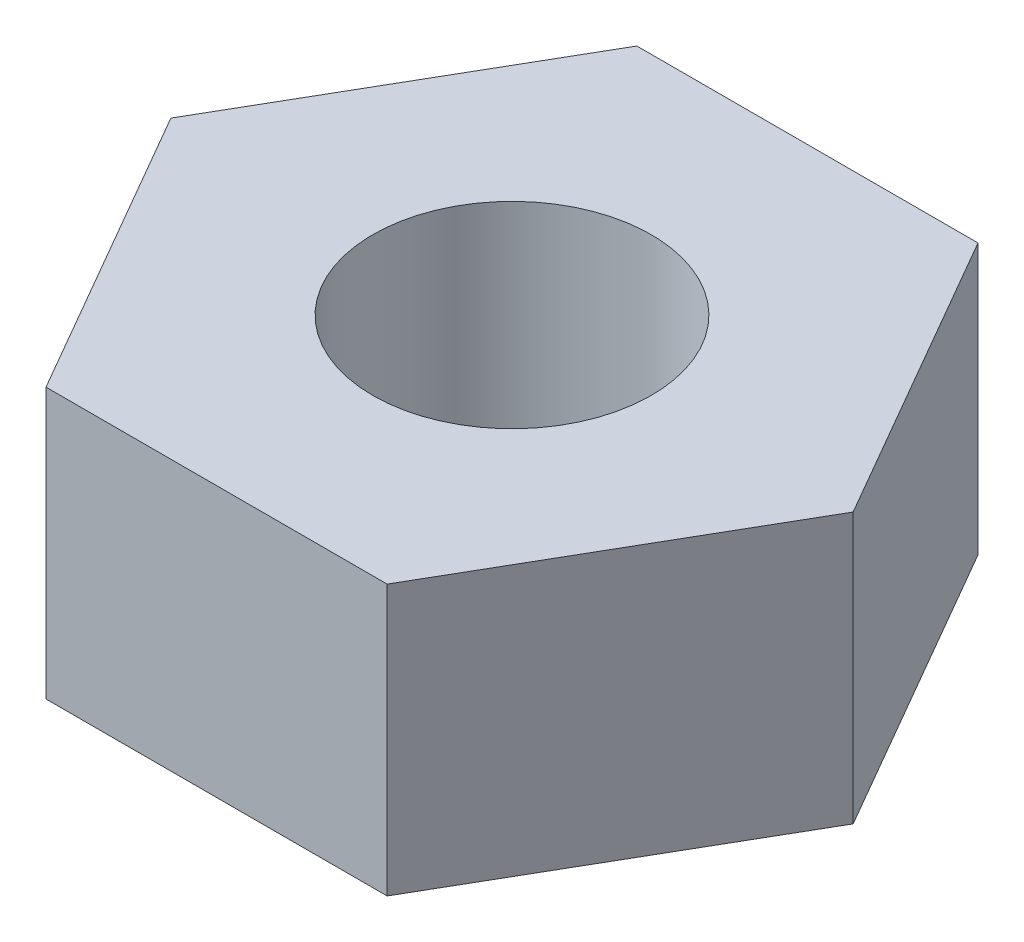
ISO-10303-21;
HEADER;
FILE_DESCRIPTION(('STEP AP214'),'2;1');
FILE_NAME('part.step','',(''),(''),'','','');
FILE_SCHEMA(('AUTOMOTIVE_DESIGN { 1 0 10303 214 1 1 1 1 }'));
ENDSEC;
DATA;
#1=APPLICATION_CONTEXT('core data for automotive mechanical design processes');
#2=APPLICATION_PROTOCOL_DEFINITION('international standard','automotive_design',2000,#1);
#3=PRODUCT_CONTEXT('',#1,'mechanical');
#4=PRODUCT('Part','Part','',(#3));
#5=PRODUCT_RELATED_PRODUCT_CATEGORY('part','',(#4));
#6=PRODUCT_DEFINITION_FORMATION('','',#4);
#7=PRODUCT_DEFINITION_CONTEXT('part definition',#1,'design');
#8=PRODUCT_DEFINITION('design','',#6,#7);
#9=PRODUCT_DEFINITION_SHAPE('','',#8);
#10=(LENGTH_UNIT() NAMED_UNIT(*) SI_UNIT(.MILLI.,.METRE.));
#11=(NAMED_UNIT(*) PLANE_ANGLE_UNIT() SI_UNIT($,.RADIAN.));
#12=(NAMED_UNIT(*) SI_UNIT($,.STERADIAN.) SOLID_ANGLE_UNIT());
#13=UNCERTAINTY_MEASURE_WITH_UNIT(LENGTH_MEASURE(1.E-05),#10,'distance_accuracy_value','');
#14=(GEOMETRIC_REPRESENTATION_CONTEXT(3) GLOBAL_UNCERTAINTY_ASSIGNED_CONTEXT((#13)) GLOBAL_UNIT_ASSIGNED_CONTEXT((#10,
#11,#12)) REPRESENTATION_CONTEXT('',''));
#15=CARTESIAN_POINT('',(0.,0.,0.));
#16=DIRECTION('',(0.,0.,1.));
#17=DIRECTION('',(1.,0.,0.));
#18=AXIS2_PLACEMENT_3D('',#15,#16,#17);
#19=CARTESIAN_POINT('',(-2.02072594216369,3.2,-3.5));
#20=DIRECTION('',(0.,1.,0.));
#21=DIRECTION('',(0.,0.,1.));
#22=AXIS2_PLACEMENT_3D('',#19,#20,#21);
#23=PLANE('',#22);
#24=DIRECTION('',(-1.,0.,0.));
#25=VECTOR('',#24,1.);
#26=CARTESIAN_POINT('',(2.02072594216369,3.2,-3.5));
#27=LINE('',#26,#25);
#28=CARTESIAN_POINT('',(2.02072594216369,3.2,-3.5));
#29=VERTEX_POINT('',#28);
#30=CARTESIAN_POINT('',(-2.02072594216369,3.2,-3.5));
#31=VERTEX_POINT('',#30);
#32=EDGE_CURVE('E130',#29,#31,#27,.T.);
#33=ORIENTED_EDGE('',*,*,#32,.T.);
#34=DIRECTION('',(-0.5,0.,0.866025403784439));
#35=VECTOR('',#34,1.);
#36=CARTESIAN_POINT('',(-2.02072594216369,3.2,-3.5));
#37=LINE('',#36,#35);
#38=CARTESIAN_POINT('',(-4.04145188432738,3.2,0.));
#39=VERTEX_POINT('',#38);
#40=EDGE_CURVE('E88',#31,#39,#37,.T.);
#41=ORIENTED_EDGE('',*,*,#40,.T.);
#42=DIRECTION('',(0.5,0.,0.866025403784439));
#43=VECTOR('',#42,1.);
#44=CARTESIAN_POINT('',(-4.04145188432738,3.2,0.));
#45=LINE('',#44,#43);
#46=CARTESIAN_POINT('',(-2.02072594216369,3.2,3.5));
#47=VERTEX_POINT('',#46);
#48=EDGE_CURVE('E101',#39,#47,#45,.T.);
#49=ORIENTED_EDGE('',*,*,#48,.T.);
#50=DIRECTION('',(1.,0.,0.));
#51=VECTOR('',#50,1.);
#52=CARTESIAN_POINT('',(-2.02072594216369,3.2,3.5));
#53=LINE('',#52,#51);
#54=CARTESIAN_POINT('',(2.02072594216369,3.2,3.5));
#55=VERTEX_POINT('',#54);
#56=EDGE_CURVE('E95',#47,#55,#53,.T.);
#57=ORIENTED_EDGE('',*,*,#56,.T.);
#58=DIRECTION('',(0.5,0.,-0.866025403784439));
#59=VECTOR('',#58,1.);
#60=CARTESIAN_POINT('',(2.02072594216369,3.2,3.5));
#61=LINE('',#60,#59);
#62=CARTESIAN_POINT('',(4.04145188432738,3.2,0.));
#63=VERTEX_POINT('',#62);
#64=EDGE_CURVE('E99',#55,#63,#61,.T.);
#65=ORIENTED_EDGE('',*,*,#64,.T.);
#66=DIRECTION('',(-0.5,0.,-0.866025403784439));
#67=VECTOR('',#66,1.);
#68=CARTESIAN_POINT('',(4.04145188432738,3.2,0.));
#69=LINE('',#68,#67);
#70=EDGE_CURVE('E51',#63,#29,#69,.T.);
#71=ORIENTED_EDGE('',*,*,#70,.T.);
#72=EDGE_LOOP('',(#33,#41,#49,#57,#65,#71));
#73=FACE_BOUND('',#72,.T.);
#74=CARTESIAN_POINT('',(0.,3.2,0.));
#75=DIRECTION('',(0.,1.,0.));
#76=DIRECTION('',(0.,0.,1.));
#77=AXIS2_PLACEMENT_3D('',#74,#75,#76);
#78=CIRCLE('',#77,1.65);
#79=CARTESIAN_POINT('',(0.,3.2,1.65));
#80=VERTEX_POINT('',#79);
#81=EDGE_CURVE('E123',#80,#80,#78,.T.);
#82=ORIENTED_EDGE('',*,*,#81,.F.);
#83=EDGE_LOOP('',(#82));
#84=FACE_BOUND('',#83,.T.);
#85=ADVANCED_FACE('F34',(#73,#84),#23,.T.);
#86=CARTESIAN_POINT('',(-2.02072594216369,0.,-3.5));
#87=DIRECTION('',(0.,1.,0.));
#88=DIRECTION('',(0.,0.,1.));
#89=AXIS2_PLACEMENT_3D('',#86,#87,#88);
#90=PLANE('',#89);
#91=DIRECTION('',(-1.,0.,0.));
#92=VECTOR('',#91,1.);
#93=CARTESIAN_POINT('',(2.02072594216369,0.,-3.5));
#94=LINE('',#93,#92);
#95=CARTESIAN_POINT('',(2.02072594216369,0.,-3.5));
#96=VERTEX_POINT('',#95);
#97=CARTESIAN_POINT('',(-2.02072594216369,0.,-3.5));
#98=VERTEX_POINT('',#97);
#99=EDGE_CURVE('E119',#96,#98,#94,.T.);
#100=ORIENTED_EDGE('',*,*,#99,.F.);
#101=DIRECTION('',(-0.5,0.,-0.866025403784439));
#102=VECTOR('',#101,1.);
#103=CARTESIAN_POINT('',(4.04145188432738,0.,0.));
#104=LINE('',#103,#102);
#105=CARTESIAN_POINT('',(4.04145188432738,0.,0.));
#106=VERTEX_POINT('',#105);
#107=EDGE_CURVE('E80',#106,#96,#104,.T.);
#108=ORIENTED_EDGE('',*,*,#107,.F.);
#109=DIRECTION('',(0.5,0.,-0.866025403784439));
#110=VECTOR('',#109,1.);
#111=CARTESIAN_POINT('',(2.02072594216369,0.,3.5));
#112=LINE('',#111,#110);
#113=CARTESIAN_POINT('',(2.02072594216369,0.,3.5));
#114=VERTEX_POINT('',#113);
#115=EDGE_CURVE('E74',#114,#106,#112,.T.);
#116=ORIENTED_EDGE('',*,*,#115,.F.);
#117=DIRECTION('',(1.,0.,0.));
#118=VECTOR('',#117,1.);
#119=CARTESIAN_POINT('',(-2.02072594216369,0.,3.5));
#120=LINE('',#119,#118);
#121=CARTESIAN_POINT('',(-2.02072594216369,0.,3.5));
#122=VERTEX_POINT('',#121);
#123=EDGE_CURVE('E109',#122,#114,#120,.T.);
#124=ORIENTED_EDGE('',*,*,#123,.F.);
#125=DIRECTION('',(0.5,0.,0.866025403784439));
#126=VECTOR('',#125,1.);
#127=CARTESIAN_POINT('',(-4.04145188432738,0.,0.));
#128=LINE('',#127,#126);
#129=CARTESIAN_POINT('',(-4.04145188432738,0.,0.));
#130=VERTEX_POINT('',#129);
#131=EDGE_CURVE('E125',#130,#122,#128,.T.);
#132=ORIENTED_EDGE('',*,*,#131,.F.);
#133=DIRECTION('',(-0.5,0.,0.866025403784439));
#134=VECTOR('',#133,1.);
#135=CARTESIAN_POINT('',(-2.02072594216369,0.,-3.5));
#136=LINE('',#135,#134);
#137=EDGE_CURVE('E122',#98,#130,#136,.T.);
#138=ORIENTED_EDGE('',*,*,#137,.F.);
#139=EDGE_LOOP('',(#100,#108,#116,#124,#132,#138));
#140=FACE_BOUND('',#139,.T.);
#141=CARTESIAN_POINT('',(0.,0.,0.));
#142=DIRECTION('',(0.,1.,0.));
#143=DIRECTION('',(0.,0.,1.));
#144=AXIS2_PLACEMENT_3D('',#141,#142,#143);
#145=CIRCLE('',#144,1.65);
#146=CARTESIAN_POINT('',(0.,0.,1.65));
#147=VERTEX_POINT('',#146);
#148=EDGE_CURVE('E223',#147,#147,#145,.T.);
#149=ORIENTED_EDGE('',*,*,#148,.T.);
#150=EDGE_LOOP('',(#149));
#151=FACE_BOUND('',#150,.T.);
#152=ADVANCED_FACE('F139',(#140,#151),#90,.F.);
#153=CARTESIAN_POINT('',(2.02072594216369,3.2,-3.5));
#154=DIRECTION('',(0.,0.,1.));
#155=DIRECTION('',(1.,0.,0.));
#156=AXIS2_PLACEMENT_3D('',#153,#154,#155);
#157=PLANE('',#156);
#158=ORIENTED_EDGE('',*,*,#99,.T.);
#159=DIRECTION('',(0.,-1.,0.));
#160=VECTOR('',#159,1.);
#161=CARTESIAN_POINT('',(-2.02072594216369,3.2,-3.5));
#162=LINE('',#161,#160);
#163=EDGE_CURVE('E11',#31,#98,#162,.T.);
#164=ORIENTED_EDGE('',*,*,#163,.F.);
#165=ORIENTED_EDGE('',*,*,#32,.F.);
#166=DIRECTION('',(0.,-1.,0.));
#167=VECTOR('',#166,1.);
#168=CARTESIAN_POINT('',(2.02072594216369,3.2,-3.5));
#169=LINE('',#168,#167);
#170=EDGE_CURVE('E115',#29,#96,#169,.T.);
#171=ORIENTED_EDGE('',*,*,#170,.T.);
#172=EDGE_LOOP('',(#158,#164,#165,#171));
#173=FACE_BOUND('',#172,.T.);
#174=ADVANCED_FACE('F36',(#173),#157,.F.);
#175=CARTESIAN_POINT('',(-2.02072594216369,3.2,-3.5));
#176=DIRECTION('',(0.866025403784438,0.,0.5));
#177=DIRECTION('',(0.5,0.,-0.866025403784439));
#178=AXIS2_PLACEMENT_3D('',#175,#176,#177);
#179=PLANE('',#178);
#180=ORIENTED_EDGE('',*,*,#137,.T.);
#181=DIRECTION('',(0.,-1.,0.));
#182=VECTOR('',#181,1.);
#183=CARTESIAN_POINT('',(-4.04145188432738,3.2,0.));
#184=LINE('',#183,#182);
#185=EDGE_CURVE('E43',#39,#130,#184,.T.);
#186=ORIENTED_EDGE('',*,*,#185,.F.);
#187=ORIENTED_EDGE('',*,*,#40,.F.);
#188=ORIENTED_EDGE('',*,*,#163,.T.);
#189=EDGE_LOOP('',(#180,#186,#187,#188));
#190=FACE_BOUND('',#189,.T.);
#191=ADVANCED_FACE('F164',(#190),#179,.F.);
#192=CARTESIAN_POINT('',(-4.04145188432738,3.2,0.));
#193=DIRECTION('',(0.866025403784439,0.,-0.5));
#194=DIRECTION('',(-0.5,0.,-0.866025403784439));
#195=AXIS2_PLACEMENT_3D('',#192,#193,#194);
#196=PLANE('',#195);
#197=ORIENTED_EDGE('',*,*,#131,.T.);
#198=DIRECTION('',(0.,-1.,0.));
#199=VECTOR('',#198,1.);
#200=CARTESIAN_POINT('',(-2.02072594216369,3.2,3.5));
#201=LINE('',#200,#199);
#202=EDGE_CURVE('E110',#47,#122,#201,.T.);
#203=ORIENTED_EDGE('',*,*,#202,.F.);
#204=ORIENTED_EDGE('',*,*,#48,.F.);
#205=ORIENTED_EDGE('',*,*,#185,.T.);
#206=EDGE_LOOP('',(#197,#203,#204,#205));
#207=FACE_BOUND('',#206,.T.);
#208=ADVANCED_FACE('F136',(#207),#196,.F.);
#209=CARTESIAN_POINT('',(-2.02072594216369,3.2,3.5));
#210=DIRECTION('',(0.,0.,-1.));
#211=DIRECTION('',(-1.,0.,0.));
#212=AXIS2_PLACEMENT_3D('',#209,#210,#211);
#213=PLANE('',#212);
#214=ORIENTED_EDGE('',*,*,#123,.T.);
#215=DIRECTION('',(0.,-1.,0.));
#216=VECTOR('',#215,1.);
#217=CARTESIAN_POINT('',(2.02072594216369,3.2,3.5));
#218=LINE('',#217,#216);
#219=EDGE_CURVE('E106',#55,#114,#218,.T.);
#220=ORIENTED_EDGE('',*,*,#219,.F.);
#221=ORIENTED_EDGE('',*,*,#56,.F.);
#222=ORIENTED_EDGE('',*,*,#202,.T.);
#223=EDGE_LOOP('',(#214,#220,#221,#222));
#224=FACE_BOUND('',#223,.T.);
#225=ADVANCED_FACE('F107',(#224),#213,.F.);
#226=CARTESIAN_POINT('',(2.02072594216369,3.2,3.5));
#227=DIRECTION('',(-0.866025403784439,0.,-0.5));
#228=DIRECTION('',(-0.5,0.,0.866025403784439));
#229=AXIS2_PLACEMENT_3D('',#226,#227,#228);
#230=PLANE('',#229);
#231=ORIENTED_EDGE('',*,*,#115,.T.);
#232=DIRECTION('',(0.,-1.,0.));
#233=VECTOR('',#232,1.);
#234=CARTESIAN_POINT('',(4.04145188432738,3.2,0.));
#235=LINE('',#234,#233);
#236=EDGE_CURVE('E111',#63,#106,#235,.T.);
#237=ORIENTED_EDGE('',*,*,#236,.F.);
#238=ORIENTED_EDGE('',*,*,#64,.F.);
#239=ORIENTED_EDGE('',*,*,#219,.T.);
#240=EDGE_LOOP('',(#231,#237,#238,#239));
#241=FACE_BOUND('',#240,.T.);
#242=ADVANCED_FACE('F113',(#241),#230,.F.);
#243=CARTESIAN_POINT('',(4.04145188432738,3.2,0.));
#244=DIRECTION('',(-0.866025403784439,0.,0.5));
#245=DIRECTION('',(0.5,0.,0.866025403784439));
#246=AXIS2_PLACEMENT_3D('',#243,#244,#245);
#247=PLANE('',#246);
#248=ORIENTED_EDGE('',*,*,#107,.T.);
#249=ORIENTED_EDGE('',*,*,#170,.F.);
#250=ORIENTED_EDGE('',*,*,#70,.F.);
#251=ORIENTED_EDGE('',*,*,#236,.T.);
#252=EDGE_LOOP('',(#248,#249,#250,#251));
#253=FACE_BOUND('',#252,.T.);
#254=ADVANCED_FACE('F144',(#253),#247,.F.);
#255=CARTESIAN_POINT('',(0.,3.2,0.));
#256=DIRECTION('',(0.,-1.,0.));
#257=DIRECTION('',(0.,0.,-1.));
#258=AXIS2_PLACEMENT_3D('',#255,#256,#257);
#259=CYLINDRICAL_SURFACE('',#258,1.65);
#260=ORIENTED_EDGE('',*,*,#81,.T.);
#261=EDGE_LOOP('',(#260));
#262=FACE_BOUND('',#261,.T.);
#263=ORIENTED_EDGE('',*,*,#148,.F.);
#264=EDGE_LOOP('',(#263));
#265=FACE_BOUND('',#264,.T.);
#266=ADVANCED_FACE('F146',(#262,#265),#259,.F.);
#267=CLOSED_SHELL('',(#85,#152,#174,#191,#208,#225,#242,#254,#266));
#268=MANIFOLD_SOLID_BREP('B2',#267);
#269=ADVANCED_BREP_SHAPE_REPRESENTATION('',(#18,#268),#14);
#270=SHAPE_DEFINITION_REPRESENTATION(#9,#269);
ENDSEC;
END-ISO-10303-21;
